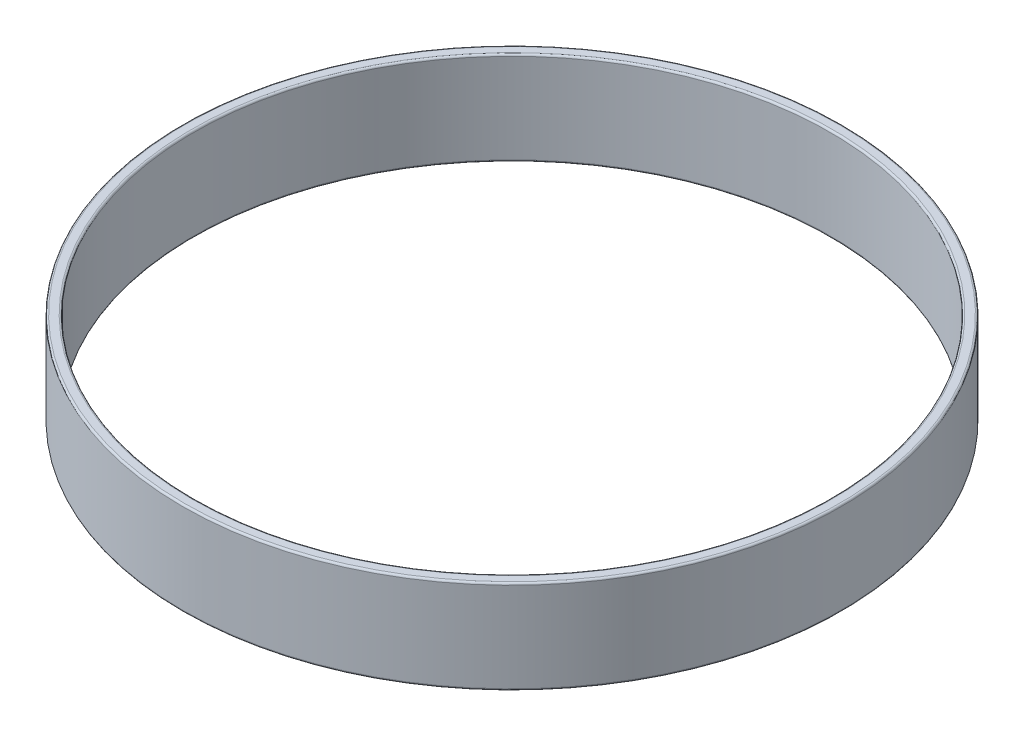
ISO-10303-21;
HEADER;
FILE_DESCRIPTION(('STEP AP214'),'2;1');
FILE_NAME('part.step','',(''),(''),'','','');
FILE_SCHEMA(('AUTOMOTIVE_DESIGN { 1 0 10303 214 1 1 1 1 }'));
ENDSEC;
DATA;
#1=APPLICATION_CONTEXT('core data for automotive mechanical design processes');
#2=APPLICATION_PROTOCOL_DEFINITION('international standard','automotive_design',2000,#1);
#3=PRODUCT_CONTEXT('',#1,'mechanical');
#4=PRODUCT('Part','Part','',(#3));
#5=PRODUCT_RELATED_PRODUCT_CATEGORY('part','',(#4));
#6=PRODUCT_DEFINITION_FORMATION('','',#4);
#7=PRODUCT_DEFINITION_CONTEXT('part definition',#1,'design');
#8=PRODUCT_DEFINITION('design','',#6,#7);
#9=PRODUCT_DEFINITION_SHAPE('','',#8);
#10=(LENGTH_UNIT() NAMED_UNIT(*) SI_UNIT(.MILLI.,.METRE.));
#11=(NAMED_UNIT(*) PLANE_ANGLE_UNIT() SI_UNIT($,.RADIAN.));
#12=(NAMED_UNIT(*) SI_UNIT($,.STERADIAN.) SOLID_ANGLE_UNIT());
#13=UNCERTAINTY_MEASURE_WITH_UNIT(LENGTH_MEASURE(1.E-05),#10,'distance_accuracy_value','');
#14=(GEOMETRIC_REPRESENTATION_CONTEXT(3) GLOBAL_UNCERTAINTY_ASSIGNED_CONTEXT((#13)) GLOBAL_UNIT_ASSIGNED_CONTEXT((#10,
#11,#12)) REPRESENTATION_CONTEXT('',''));
#15=CARTESIAN_POINT('',(0.,0.,0.));
#16=DIRECTION('',(0.,0.,1.));
#17=DIRECTION('',(1.,0.,0.));
#18=AXIS2_PLACEMENT_3D('',#15,#16,#17);
#19=CARTESIAN_POINT('',(0.,12.5,0.));
#20=DIRECTION('',(0.,1.,0.));
#21=DIRECTION('',(0.,0.,1.));
#22=AXIS2_PLACEMENT_3D('',#19,#20,#21);
#23=PLANE('',#22);
#24=CARTESIAN_POINT('',(0.,12.5,0.));
#25=DIRECTION('',(0.,1.,0.));
#26=DIRECTION('',(0.,0.,1.));
#27=AXIS2_PLACEMENT_3D('',#24,#25,#26);
#28=CIRCLE('',#27,85.75);
#29=CARTESIAN_POINT('',(0.,12.5,85.75));
#30=VERTEX_POINT('',#29);
#31=EDGE_CURVE('E10',#30,#30,#28,.F.);
#32=ORIENTED_EDGE('',*,*,#31,.T.);
#33=EDGE_LOOP('',(#32));
#34=FACE_BOUND('',#33,.T.);
#35=CARTESIAN_POINT('',(0.,12.5,0.));
#36=DIRECTION('',(0.,1.,0.));
#37=DIRECTION('',(0.,0.,1.));
#38=AXIS2_PLACEMENT_3D('',#35,#36,#37);
#39=CIRCLE('',#38,87.75);
#40=CARTESIAN_POINT('',(0.,12.5,87.75));
#41=VERTEX_POINT('',#40);
#42=EDGE_CURVE('E45',#41,#41,#39,.T.);
#43=ORIENTED_EDGE('',*,*,#42,.T.);
#44=EDGE_LOOP('',(#43));
#45=FACE_BOUND('',#44,.T.);
#46=ADVANCED_FACE('F37',(#34,#45),#23,.T.);
#47=CARTESIAN_POINT('',(0.,-12.5,0.));
#48=DIRECTION('',(0.,1.,0.));
#49=DIRECTION('',(0.,0.,1.));
#50=AXIS2_PLACEMENT_3D('',#47,#48,#49);
#51=PLANE('',#50);
#52=CARTESIAN_POINT('',(0.,-12.5,0.));
#53=DIRECTION('',(0.,1.,0.));
#54=DIRECTION('',(0.,0.,1.));
#55=AXIS2_PLACEMENT_3D('',#52,#53,#54);
#56=CIRCLE('',#55,85.75);
#57=CARTESIAN_POINT('',(0.,-12.5,85.75));
#58=VERTEX_POINT('',#57);
#59=EDGE_CURVE('E69',#58,#58,#56,.T.);
#60=ORIENTED_EDGE('',*,*,#59,.T.);
#61=EDGE_LOOP('',(#60));
#62=FACE_BOUND('',#61,.T.);
#63=CARTESIAN_POINT('',(0.,-12.5,0.));
#64=DIRECTION('',(0.,1.,0.));
#65=DIRECTION('',(0.,0.,1.));
#66=AXIS2_PLACEMENT_3D('',#63,#64,#65);
#67=CIRCLE('',#66,87.75);
#68=CARTESIAN_POINT('',(0.,-12.5,87.75));
#69=VERTEX_POINT('',#68);
#70=EDGE_CURVE('E73',#69,#69,#67,.F.);
#71=ORIENTED_EDGE('',*,*,#70,.T.);
#72=EDGE_LOOP('',(#71));
#73=FACE_BOUND('',#72,.T.);
#74=ADVANCED_FACE('F78',(#62,#73),#51,.F.);
#75=CARTESIAN_POINT('',(0.,12.5,0.));
#76=DIRECTION('',(0.,-1.,0.));
#77=DIRECTION('',(0.,0.,-1.));
#78=AXIS2_PLACEMENT_3D('',#75,#76,#77);
#79=CYLINDRICAL_SURFACE('',#78,88.25);
#80=CARTESIAN_POINT('',(0.,-12.,0.));
#81=DIRECTION('',(0.,1.,0.));
#82=DIRECTION('',(0.,0.,1.));
#83=AXIS2_PLACEMENT_3D('',#80,#81,#82);
#84=CIRCLE('',#83,88.25);
#85=CARTESIAN_POINT('',(0.,-12.,88.25));
#86=VERTEX_POINT('',#85);
#87=EDGE_CURVE('E50',#86,#86,#84,.T.);
#88=ORIENTED_EDGE('',*,*,#87,.T.);
#89=EDGE_LOOP('',(#88));
#90=FACE_BOUND('',#89,.T.);
#91=CARTESIAN_POINT('',(0.,12.,0.));
#92=DIRECTION('',(0.,1.,0.));
#93=DIRECTION('',(0.,0.,1.));
#94=AXIS2_PLACEMENT_3D('',#91,#92,#93);
#95=CIRCLE('',#94,88.25);
#96=CARTESIAN_POINT('',(0.,12.,88.25));
#97=VERTEX_POINT('',#96);
#98=EDGE_CURVE('E55',#97,#97,#95,.F.);
#99=ORIENTED_EDGE('',*,*,#98,.T.);
#100=EDGE_LOOP('',(#99));
#101=FACE_BOUND('',#100,.T.);
#102=ADVANCED_FACE('F88',(#90,#101),#79,.T.);
#103=CARTESIAN_POINT('',(0.,12.5,0.));
#104=DIRECTION('',(0.,-1.,0.));
#105=DIRECTION('',(0.,0.,-1.));
#106=AXIS2_PLACEMENT_3D('',#103,#104,#105);
#107=CYLINDRICAL_SURFACE('',#106,85.25);
#108=CARTESIAN_POINT('',(0.,-12.,0.));
#109=DIRECTION('',(0.,1.,0.));
#110=DIRECTION('',(0.,0.,1.));
#111=AXIS2_PLACEMENT_3D('',#108,#109,#110);
#112=CIRCLE('',#111,85.25);
#113=CARTESIAN_POINT('',(0.,-12.,85.25));
#114=VERTEX_POINT('',#113);
#115=EDGE_CURVE('E61',#114,#114,#112,.F.);
#116=ORIENTED_EDGE('',*,*,#115,.T.);
#117=EDGE_LOOP('',(#116));
#118=FACE_BOUND('',#117,.T.);
#119=CARTESIAN_POINT('',(0.,12.,0.));
#120=DIRECTION('',(0.,1.,0.));
#121=DIRECTION('',(0.,0.,1.));
#122=AXIS2_PLACEMENT_3D('',#119,#120,#121);
#123=CIRCLE('',#122,85.25);
#124=CARTESIAN_POINT('',(0.,12.,85.25));
#125=VERTEX_POINT('',#124);
#126=EDGE_CURVE('E65',#125,#125,#123,.T.);
#127=ORIENTED_EDGE('',*,*,#126,.T.);
#128=EDGE_LOOP('',(#127));
#129=FACE_BOUND('',#128,.T.);
#130=ADVANCED_FACE('F91',(#118,#129),#107,.F.);
#131=CARTESIAN_POINT('',(0.,-12.,0.));
#132=DIRECTION('',(0.,1.,0.));
#133=DIRECTION('',(0.,0.,1.));
#134=AXIS2_PLACEMENT_3D('',#131,#132,#133);
#135=TOROIDAL_SURFACE('',#134,85.75,0.5);
#136=ORIENTED_EDGE('',*,*,#115,.F.);
#137=EDGE_LOOP('',(#136));
#138=FACE_BOUND('',#137,.T.);
#139=ORIENTED_EDGE('',*,*,#59,.F.);
#140=EDGE_LOOP('',(#139));
#141=FACE_BOUND('',#140,.T.);
#142=ADVANCED_FACE('F84',(#138,#141),#135,.T.);
#143=CARTESIAN_POINT('',(0.,-12.,0.));
#144=DIRECTION('',(0.,1.,0.));
#145=DIRECTION('',(0.,0.,1.));
#146=AXIS2_PLACEMENT_3D('',#143,#144,#145);
#147=TOROIDAL_SURFACE('',#146,87.75,0.5);
#148=ORIENTED_EDGE('',*,*,#70,.F.);
#149=EDGE_LOOP('',(#148));
#150=FACE_BOUND('',#149,.T.);
#151=ORIENTED_EDGE('',*,*,#87,.F.);
#152=EDGE_LOOP('',(#151));
#153=FACE_BOUND('',#152,.T.);
#154=ADVANCED_FACE('F80',(#150,#153),#147,.T.);
#155=CARTESIAN_POINT('',(0.,12.,0.));
#156=DIRECTION('',(0.,1.,0.));
#157=DIRECTION('',(0.,0.,1.));
#158=AXIS2_PLACEMENT_3D('',#155,#156,#157);
#159=TOROIDAL_SURFACE('',#158,85.75,0.5);
#160=ORIENTED_EDGE('',*,*,#31,.F.);
#161=EDGE_LOOP('',(#160));
#162=FACE_BOUND('',#161,.T.);
#163=ORIENTED_EDGE('',*,*,#126,.F.);
#164=EDGE_LOOP('',(#163));
#165=FACE_BOUND('',#164,.T.);
#166=ADVANCED_FACE('F83',(#162,#165),#159,.T.);
#167=CARTESIAN_POINT('',(0.,12.,0.));
#168=DIRECTION('',(0.,1.,0.));
#169=DIRECTION('',(0.,0.,1.));
#170=AXIS2_PLACEMENT_3D('',#167,#168,#169);
#171=TOROIDAL_SURFACE('',#170,87.75,0.5);
#172=ORIENTED_EDGE('',*,*,#98,.F.);
#173=EDGE_LOOP('',(#172));
#174=FACE_BOUND('',#173,.T.);
#175=ORIENTED_EDGE('',*,*,#42,.F.);
#176=EDGE_LOOP('',(#175));
#177=FACE_BOUND('',#176,.T.);
#178=ADVANCED_FACE('F39',(#174,#177),#171,.T.);
#179=CLOSED_SHELL('',(#46,#74,#102,#130,#142,#154,#166,#178));
#180=MANIFOLD_SOLID_BREP('B2',#179);
#181=ADVANCED_BREP_SHAPE_REPRESENTATION('',(#18,#180),#14);
#182=SHAPE_DEFINITION_REPRESENTATION(#9,#181);
ENDSEC;
END-ISO-10303-21;
